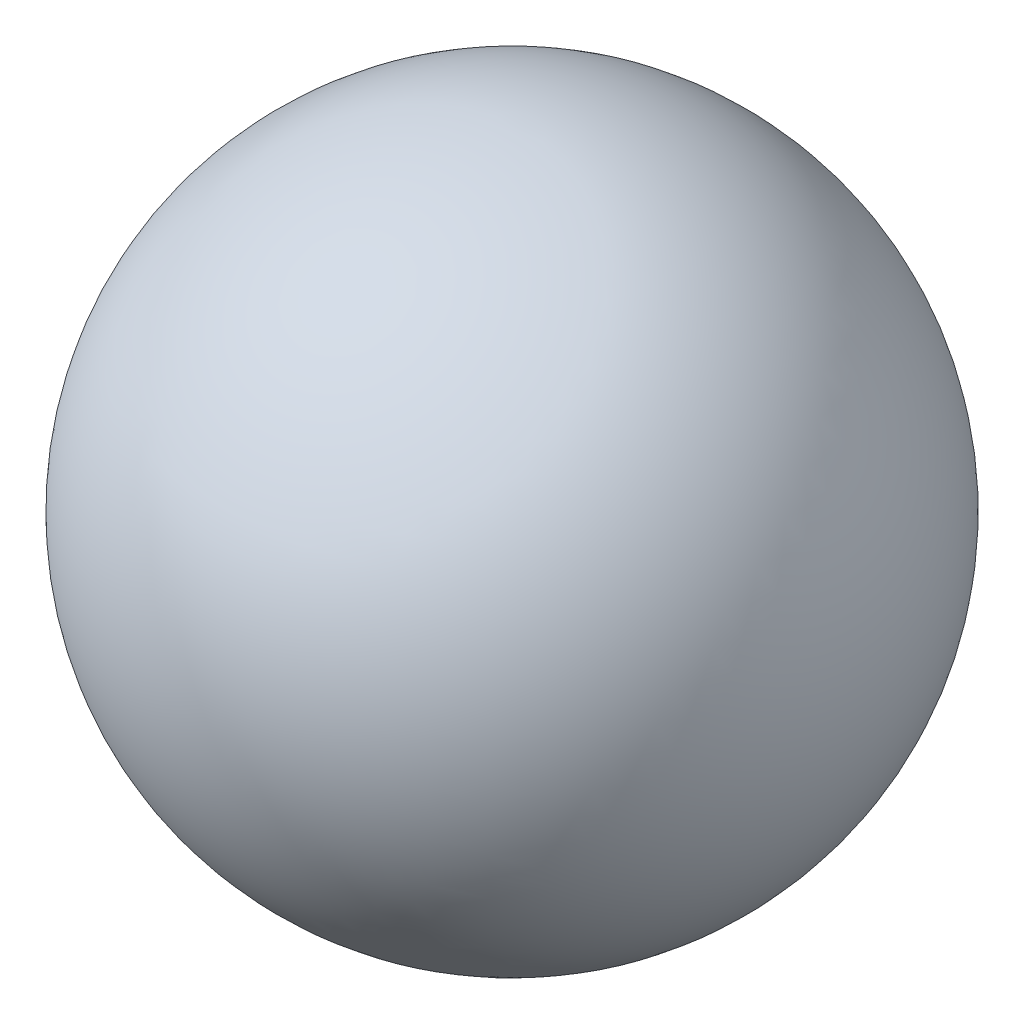
ISO-10303-21;
HEADER;
FILE_DESCRIPTION(('STEP AP214'),'2;1');
FILE_NAME('part.step','',(''),(''),'','','');
FILE_SCHEMA(('AUTOMOTIVE_DESIGN { 1 0 10303 214 1 1 1 1 }'));
ENDSEC;
DATA;
#1=APPLICATION_CONTEXT('core data for automotive mechanical design processes');
#2=APPLICATION_PROTOCOL_DEFINITION('international standard','automotive_design',2000,#1);
#3=PRODUCT_CONTEXT('',#1,'mechanical');
#4=PRODUCT('Part','Part','',(#3));
#5=PRODUCT_RELATED_PRODUCT_CATEGORY('part','',(#4));
#6=PRODUCT_DEFINITION_FORMATION('','',#4);
#7=PRODUCT_DEFINITION_CONTEXT('part definition',#1,'design');
#8=PRODUCT_DEFINITION('design','',#6,#7);
#9=PRODUCT_DEFINITION_SHAPE('','',#8);
#10=(LENGTH_UNIT() NAMED_UNIT(*) SI_UNIT(.MILLI.,.METRE.));
#11=(NAMED_UNIT(*) PLANE_ANGLE_UNIT() SI_UNIT($,.RADIAN.));
#12=(NAMED_UNIT(*) SI_UNIT($,.STERADIAN.) SOLID_ANGLE_UNIT());
#13=UNCERTAINTY_MEASURE_WITH_UNIT(LENGTH_MEASURE(1.E-05),#10,'distance_accuracy_value','');
#14=(GEOMETRIC_REPRESENTATION_CONTEXT(3) GLOBAL_UNCERTAINTY_ASSIGNED_CONTEXT((#13)) GLOBAL_UNIT_ASSIGNED_CONTEXT((#10,
#11,#12)) REPRESENTATION_CONTEXT('',''));
#15=CARTESIAN_POINT('',(0.,0.,0.));
#16=DIRECTION('',(0.,0.,1.));
#17=DIRECTION('',(1.,0.,0.));
#18=AXIS2_PLACEMENT_3D('',#15,#16,#17);
#19=CARTESIAN_POINT('',(0.,30.,0.));
#20=DIRECTION('',(0.,-1.,0.));
#21=DIRECTION('',(1.,0.,0.));
#22=AXIS2_PLACEMENT_3D('',#19,#20,#21);
#23=SPHERICAL_SURFACE('',#22,28.);
#24=CARTESIAN_POINT('',(-1.69343771057122,16.8390950446225,-24.6560911057137));
#25=CARTESIAN_POINT('',(-1.80721544557106,16.7343212200804,-24.5923494827678));
#26=CARTESIAN_POINT('',(-1.90955386479451,16.6205339274216,-24.5228758961835));
#27=CARTESIAN_POINT('',(-2.0900146818158,16.3800412842508,-24.3753297234898));
#28=CARTESIAN_POINT('',(-2.16810496618143,16.2533190956402,-24.2972459180732));
#29=CARTESIAN_POINT('',(-2.29934120839413,15.992104114174,-24.1354433820733));
#30=CARTESIAN_POINT('',(-2.35262130899541,15.8576576310213,-24.0517578199788));
#31=CARTESIAN_POINT('',(-2.43501793158054,15.5840463948556,-23.8805094076227));
#32=CARTESIAN_POINT('',(-2.46413866941952,15.444882469459,-23.7929472366472));
#33=CARTESIAN_POINT('',(-2.50060558721634,15.1480764095243,-23.6051291175781));
#34=CARTESIAN_POINT('',(-2.50491637262718,14.9902224646509,-23.5046117118278));
#35=CARTESIAN_POINT('',(-2.48395669965006,14.6763926172871,-23.3034741809311));
#36=CARTESIAN_POINT('',(-2.45865986440596,14.5204185146571,-23.2028540441034));
#37=CARTESIAN_POINT('',(-2.37632360178159,14.2056041334994,-22.9984596836698));
#38=CARTESIAN_POINT('',(-2.31754167946597,14.0471152273647,-22.8948370480418));
#39=CARTESIAN_POINT('',(-2.16711778754105,13.7420411405466,-22.6940802689311));
#40=CARTESIAN_POINT('',(-2.07550831407856,13.5954443631663,-22.596939821106));
#41=CARTESIAN_POINT('',(-1.88462855289481,13.3518671108071,-22.434594780959));
#42=CARTESIAN_POINT('',(-1.79191522547097,13.2512116691154,-22.3671706509649));
#43=CARTESIAN_POINT('',(-1.58789766349314,13.0641085666648,-22.2413399067739));
#44=CARTESIAN_POINT('',(-1.47661714601608,12.9776430561743,-22.1829219692449));
#45=CARTESIAN_POINT('',(-1.25493690770267,12.83439063017,-22.0858263464559));
#46=CARTESIAN_POINT('',(-1.14687938689784,12.7751008741841,-22.0455040913048));
#47=CARTESIAN_POINT('',(-0.920302512604455,12.6722340805023,-21.9754011388751));
#48=CARTESIAN_POINT('',(-0.801787308814908,12.6286508449164,-21.9456162835585));
#49=CARTESIAN_POINT('',(-0.55655986563234,12.5593959881228,-21.8982294658502));
#50=CARTESIAN_POINT('',(-0.429808537580653,12.5338178130532,-21.8806910662007));
#51=CARTESIAN_POINT('',(-0.172743442978666,12.5026218588909,-21.8592949912988));
#52=CARTESIAN_POINT('',(-0.0424312539702726,12.4969953807129,-21.8554313537518));
#53=CARTESIAN_POINT('',(0.205059737953623,12.505636101891,-21.8613605073564));
#54=CARTESIAN_POINT('',(0.32233704589999,12.5181089627676,-21.869921548045));
#55=CARTESIAN_POINT('',(0.55268397712324,12.5590526070629,-21.8979855786076));
#56=CARTESIAN_POINT('',(0.665753654147137,12.5875231860568,-21.917488428663));
#57=CARTESIAN_POINT('',(0.885613692983504,12.6592400147517,-21.9665153994858));
#58=CARTESIAN_POINT('',(0.992357638593603,12.7025826315287,-21.9961048706475));
#59=CARTESIAN_POINT('',(1.19671669609951,12.8020916220582,-22.0638594419222));
#60=CARTESIAN_POINT('',(1.29432885160541,12.8582621286881,-22.1020273057507));
#61=CARTESIAN_POINT('',(1.48948439810347,12.9883609888485,-22.1901549337846));
#62=CARTESIAN_POINT('',(1.58578517680883,13.0635760695449,-22.240958148));
#63=CARTESIAN_POINT('',(1.76442414619018,13.2248073669259,-22.349433263072));
#64=CARTESIAN_POINT('',(1.8467546684326,13.3108294709145,-22.4071089069087));
#65=CARTESIAN_POINT('',(2.00945278285601,13.5063977718894,-22.5376764503863));
#66=CARTESIAN_POINT('',(2.08722404439975,13.6174782362669,-22.6115046987858));
#67=CARTESIAN_POINT('',(2.22286097972882,13.8481249691288,-22.7639974179274));
#68=CARTESIAN_POINT('',(2.28071461944203,13.9676963153009,-22.8426647787136));
#69=CARTESIAN_POINT('',(2.38414232318549,14.2324275298433,-23.0158959407271));
#70=CARTESIAN_POINT('',(2.42624371232076,14.3786093947427,-23.1109811402494));
#71=CARTESIAN_POINT('',(2.48341552311309,14.6752160897262,-23.3026971140034));
#72=CARTESIAN_POINT('',(2.49847126444459,14.8256431791451,-23.3993286989188));
#73=CARTESIAN_POINT('',(2.50144040783855,15.1414585444242,-23.6009498329148));
#74=CARTESIAN_POINT('',(2.48667030403915,15.3069244007669,-23.7058714905356));
#75=CARTESIAN_POINT('',(2.42398647095646,15.6340591467102,-23.9119719396783));
#76=CARTESIAN_POINT('',(2.3760572376099,15.7957262235566,-24.0131489570128));
#77=CARTESIAN_POINT('',(2.24765238017885,16.107249414231,-24.20695619128));
#78=CARTESIAN_POINT('',(2.16770173631508,16.2572515428551,-24.299695998421));
#79=CARTESIAN_POINT('',(1.9754241817146,16.5417675759211,-24.4746942834401));
#80=CARTESIAN_POINT('',(1.86315870411258,16.676310197375,-24.5569722262374));
#81=CARTESIAN_POINT('',(1.64276022234429,16.888916297479,-24.6864434357093));
#82=CARTESIAN_POINT('',(1.54182764462273,16.9723826287008,-24.7370893142265));
#83=CARTESIAN_POINT('',(1.32515536462847,17.1240070582851,-24.8288605024288));
#84=CARTESIAN_POINT('',(1.20942442926551,17.1921741549376,-24.8699914088127));
#85=CARTESIAN_POINT('',(0.964918933499779,17.3102953309664,-24.941133546458));
#86=CARTESIAN_POINT('',(0.83607412881501,17.3601439388179,-24.9710803993912));
#87=CARTESIAN_POINT('',(0.569710350453295,17.4381651419889,-25.017903835515));
#88=CARTESIAN_POINT('',(0.432196008908252,17.4663492082301,-25.034787335509));
#89=CARTESIAN_POINT('',(0.167708560068092,17.4975520659172,-25.0534755433576));
#90=CARTESIAN_POINT('',(0.041096434177254,17.5028505555153,-25.0566462677171));
#91=CARTESIAN_POINT('',(-0.211217873573844,17.4942544767305,-25.0514997968747));
#92=CARTESIAN_POINT('',(-0.336920295665798,17.4803651762672,-25.0431857547628));
#93=CARTESIAN_POINT('',(-0.578437130778419,17.4351354840974,-25.0160795259398));
#94=CARTESIAN_POINT('',(-0.69444531856237,17.4045460880403,-24.9977382146975));
#95=CARTESIAN_POINT('',(-0.919226178488506,17.3279019359643,-24.9517050404129));
#96=CARTESIAN_POINT('',(-1.02799899135123,17.2818474808301,-24.9240133592892));
#97=CARTESIAN_POINT('',(-1.23604671614979,17.1761898713239,-24.860344034682));
#98=CARTESIAN_POINT('',(-1.33532332047684,17.1165891375527,-24.8243678715474));
#99=CARTESIAN_POINT('',(-1.52287765263926,16.9859329183521,-24.745293448164));
#100=CARTESIAN_POINT('',(-1.61114947106108,16.914871325178,-24.7021913900598));
#101=CARTESIAN_POINT('',(-1.69343771057122,16.8390950446225,-24.6560911057137));
#102=B_SPLINE_CURVE_WITH_KNOTS('',3,(#24,#25,#26,#27,#28,#29,#30,#31,#32,#33,#34,#35,#36,#37,
#38,#39,#40,#41,#42,#43,#44,#45,#46,#47,#48,#49,#50,#51,#52,#53,#54,#55,#56,#57,#58,#59,#60,#61,
#62,#63,#64,#65,#66,#67,#68,#69,#70,#71,#72,#73,#74,#75,#76,#77,#78,#79,#80,#81,#82,#83,#84,#85,
#86,#87,#88,#89,#90,#91,#92,#93,#94,#95,#96,#97,#98,#99,#100,#101),.UNSPECIFIED.,.T.,.F.,(4,2,2,
2,2,2,2,2,2,2,2,2,2,2,2,2,2,2,2,2,2,2,2,2,2,2,2,2,2,2,2,2,2,2,2,2,2,2,4),(0.,0.501370739223639,
1.00340267292509,1.50268778714811,2.00188575682414,2.56104143398055,3.12069563151671,
3.71254806600966,4.30381623416395,4.7597013736296,5.2150085781138,5.60243411902613,
5.98970661159021,6.37897451483074,6.76807267354658,7.12113147493536,7.4741857649079,
7.82957236657315,8.18507362829031,8.58056026824904,8.97626329798258,9.43767712767019,
9.89936925275219,10.4353346289203,10.971590838258,11.5582389113865,12.145161466427,
12.7228316308344,13.2994107693926,13.7189720557121,14.1382859253503,14.5599775745039,
14.9814457926612,15.3597924897254,15.7380353340821,16.1005230708412,16.4630037555268,
16.8254197189524,17.1880294639317),.UNSPECIFIED.);
#103=CARTESIAN_POINT('',(-1.69343771057122,16.8390950446225,-24.6560911057137));
#104=VERTEX_POINT('',#103);
#105=EDGE_CURVE('E10',#104,#104,#102,.T.);
#106=ORIENTED_EDGE('',*,*,#105,.F.);
#107=EDGE_LOOP('',(#106));
#108=FACE_BOUND('',#107,.T.);
#109=ADVANCED_FACE('F41',(#108),#23,.F.);
#110=CARTESIAN_POINT('',(0.,15.,-30.001));
#111=DIRECTION('',(0.,0.,1.));
#112=DIRECTION('',(1.,0.,0.));
#113=AXIS2_PLACEMENT_3D('',#110,#111,#112);
#114=CYLINDRICAL_SURFACE('',#113,2.5);
#115=ORIENTED_EDGE('',*,*,#105,.T.);
#116=EDGE_LOOP('',(#115));
#117=FACE_BOUND('',#116,.T.);
#118=CARTESIAN_POINT('',(-1.69244308339619,16.84001044717,-26.9063242927033));
#119=CARTESIAN_POINT('',(-1.80470110002598,16.7367455509334,-26.8487546093405));
#120=CARTESIAN_POINT('',(-1.9061580265769,16.6244003906173,-26.7859375477737));
#121=CARTESIAN_POINT('',(-2.08574747435769,16.3863621212176,-26.6523048523263));
#122=CARTESIAN_POINT('',(-2.16382067209951,16.2606361414582,-26.5814694926412));
#123=CARTESIAN_POINT('',(-2.29548018148668,16.0009201022737,-26.4345033349656));
#124=CARTESIAN_POINT('',(-2.34919418146151,15.8669774150478,-26.3584026183529));
#125=CARTESIAN_POINT('',(-2.43260469468968,15.5939810028407,-26.2025858155837));
#126=CARTESIAN_POINT('',(-2.46231071746393,15.4549293243624,-26.1228711741234));
#127=CARTESIAN_POINT('',(-2.49964531238921,15.1608546255147,-25.9534871806851));
#128=CARTESIAN_POINT('',(-2.50476962546438,15.0056247569919,-25.8636193873595));
#129=CARTESIAN_POINT('',(-2.48636658032132,14.6967859298406,-25.6838794970489));
#130=CARTESIAN_POINT('',(-2.46282251983601,14.5431779687498,-25.594007428088));
#131=CARTESIAN_POINT('',(-2.38545409089055,14.2344198216486,-25.4124224022299));
#132=CARTESIAN_POINT('',(-2.33024206407474,14.0795441063203,-25.320825366407));
#133=CARTESIAN_POINT('',(-2.18887457576023,13.7809267854306,-25.1433030182523));
#134=CARTESIAN_POINT('',(-2.10271359012714,13.6371871731437,-25.0573787217012));
#135=CARTESIAN_POINT('',(-1.90514664299241,13.3733084402181,-24.8988997039292));
#136=CARTESIAN_POINT('',(-1.79523453874315,13.252344266397,-24.8258890507411));
#137=CARTESIAN_POINT('',(-1.61139876145512,13.0868333309574,-24.7256169151847));
#138=CARTESIAN_POINT('',(-1.54698020467803,13.0343317502158,-24.6937413705277));
#139=CARTESIAN_POINT('',(-1.41215942740941,12.9353465949657,-24.6335401349075));
#140=CARTESIAN_POINT('',(-1.34175957825838,12.8888606537721,-24.605213048044));
#141=CARTESIAN_POINT('',(-1.16262761302417,12.7833827868206,-24.5408422049033));
#142=CARTESIAN_POINT('',(-1.05084606574836,12.7281108994569,-24.5070223797315));
#143=CARTESIAN_POINT('',(-0.818078722879118,12.6343121314047,-24.4495438994112));
#144=CARTESIAN_POINT('',(-0.697099291783994,12.5957737936068,-24.4258782920151));
#145=CARTESIAN_POINT('',(-0.448559121397535,12.5372490199952,-24.3899118671471));
#146=CARTESIAN_POINT('',(-0.320975268698819,12.5173331435409,-24.3776542747537));
#147=CARTESIAN_POINT('',(-0.063676239575446,12.4974844906564,-24.3654381389472));
#148=CARTESIAN_POINT('',(0.0660385726014728,12.4975483338835,-24.3654775150261));
#149=CARTESIAN_POINT('',(0.314786195245959,12.5169684781868,-24.3774297610518));
#150=CARTESIAN_POINT('',(0.433959603040743,12.5350530694516,-24.3885599600815));
#151=CARTESIAN_POINT('',(0.667152881153032,12.5876985979856,-24.4209176040736));
#152=CARTESIAN_POINT('',(0.781172651103403,12.6222598559869,-24.442145245591));
#153=CARTESIAN_POINT('',(1.00364025193365,12.7071460573558,-24.4941843558916));
#154=CARTESIAN_POINT('',(1.11192389476889,12.7577824895168,-24.5251851077869));
#155=CARTESIAN_POINT('',(1.31823150456421,12.8725098835174,-24.5952540432793));
#156=CARTESIAN_POINT('',(1.41625206622682,12.9366052899864,-24.6343248918379));
#157=CARTESIAN_POINT('',(1.61028542105624,13.0834177318932,-24.7235660648624));
#158=CARTESIAN_POINT('',(1.70501429697493,13.1673816460798,-24.774470101812));
#159=CARTESIAN_POINT('',(1.87912994829467,13.346372514889,-24.8826064297575));
#160=CARTESIAN_POINT('',(1.95850891842727,13.4414050586492,-24.9398419170991));
#161=CARTESIAN_POINT('',(2.11154709760494,13.6542967046142,-25.0675792877079));
#162=CARTESIAN_POINT('',(2.18276345319712,13.7734764224607,-25.138807670571));
#163=CARTESIAN_POINT('',(2.30394053307259,14.0198320803409,-25.2853780955886));
#164=CARTESIAN_POINT('',(2.35388970585198,14.1470123230155,-25.3607223483202));
#165=CARTESIAN_POINT('',(2.43738043340425,14.4232903302409,-25.5236392314501));
#166=CARTESIAN_POINT('',(2.46796733466895,14.5730964889612,-25.6115338252768));
#167=CARTESIAN_POINT('',(2.50152685704154,14.8754259548056,-25.7879928908241));
#168=CARTESIAN_POINT('',(2.50448662688553,15.027950493386,-25.8765576551181));
#169=CARTESIAN_POINT('',(2.48184113889202,15.3416835710105,-26.0578054792022));
#170=CARTESIAN_POINT('',(2.45439345169345,15.5028223417011,-26.150388813386));
#171=CARTESIAN_POINT('',(2.36771379239663,15.8190255034803,-26.3311400392932));
#172=CARTESIAN_POINT('',(2.30847901418956,15.9740893569889,-26.4193075404431));
#173=CARTESIAN_POINT('',(2.16071725111191,16.2678548277644,-26.5855663671278));
#174=CARTESIAN_POINT('',(2.07318171009687,16.4069199674208,-26.6638889634512));
#175=CARTESIAN_POINT('',(1.86931193764549,16.6682619598492,-26.8105059900955));
#176=CARTESIAN_POINT('',(1.75300116062771,16.7905523599808,-26.8788085158077));
#177=CARTESIAN_POINT('',(1.50873440158437,16.9991017787476,-26.9949262193183));
#178=CARTESIAN_POINT('',(1.383657925155,17.0878875469779,-27.0441944019101));
#179=CARTESIAN_POINT('',(1.18312577236907,17.2036776250905,-27.1083158299641));
#180=CARTESIAN_POINT('',(1.11412334734829,17.2393781786678,-27.1280605745225));
#181=CARTESIAN_POINT('',(0.972343126142675,17.3044811561932,-27.1640342468641));
#182=CARTESIAN_POINT('',(0.899565951381754,17.3338846127482,-27.1802637510862));
#183=CARTESIAN_POINT('',(0.69721394519105,17.404625393785,-27.2192832743737));
#184=CARTESIAN_POINT('',(0.564490280854794,17.439301082716,-27.2383772595281));
#185=CARTESIAN_POINT('',(0.294100465681308,17.4864295158054,-27.2643184160452));
#186=CARTESIAN_POINT('',(0.156437868636638,17.4988979244836,-27.2711742199555));
#187=CARTESIAN_POINT('',(-0.106590046180209,17.5008689195947,-27.2722581216505));
#188=CARTESIAN_POINT('',(-0.231940049227651,17.4923489864621,-27.2675735320073));
#189=CARTESIAN_POINT('',(-0.479182440479041,17.4568231467435,-27.2480235758659));
#190=CARTESIAN_POINT('',(-0.601074465139475,17.4298153039356,-27.2331571430326));
#191=CARTESIAN_POINT('',(-0.837239112637147,17.3588436494857,-27.1940376889017));
#192=CARTESIAN_POINT('',(-0.951558281671077,17.3149974654902,-27.1698497806428));
#193=CARTESIAN_POINT('',(-1.1708063715927,17.2122056775578,-27.1130406057359));
#194=CARTESIAN_POINT('',(-1.27574289381853,17.1532724486949,-27.0804262506377));
#195=CARTESIAN_POINT('',(-1.43176263899506,17.050533433946,-27.0234423017165));
#196=CARTESIAN_POINT('',(-1.48667042811056,17.0110506455001,-27.0015194466735));
#197=CARTESIAN_POINT('',(-1.59254979697507,16.9282897567918,-26.9555044163727));
#198=CARTESIAN_POINT('',(-1.64352207706111,16.885012334738,-26.9314126287442));
#199=CARTESIAN_POINT('',(-1.69244308339619,16.84001044717,-26.9063242927033));
#200=B_SPLINE_CURVE_WITH_KNOTS('',3,(#118,#119,#120,#121,#122,#123,#124,#125,#126,#127,#128,
#129,#130,#131,#132,#133,#134,#135,#136,#137,#138,#139,#140,#141,#142,#143,#144,#145,#146,#147,
#148,#149,#150,#151,#152,#153,#154,#155,#156,#157,#158,#159,#160,#161,#162,#163,#164,#165,#166,
#167,#168,#169,#170,#171,#172,#173,#174,#175,#176,#177,#178,#179,#180,#181,#182,#183,#184,#185,
#186,#187,#188,#189,#190,#191,#192,#193,#194,#195,#196,#197,#198,#199),.UNSPECIFIED.,.T.,.F.,(4,
2,2,2,2,2,2,2,2,2,2,2,2,2,2,2,2,2,2,2,2,2,2,2,2,2,2,2,2,2,2,2,2,2,2,2,2,2,2,2,4),(0.,
0.488814759434073,0.978859316015089,1.46630454632851,1.95355660561641,2.48952437182268,
3.02580454366766,3.58760516577864,4.14950611454587,4.68304341538674,4.94965835896393,
5.21616808938142,5.60200836228936,5.98758404030682,6.37461479042511,6.76158005935239,
7.1230431225295,7.48451322217185,7.85346549209456,8.22253979526357,8.63024296893829,
9.03815291344485,9.50441847530923,9.97093697235091,10.4977456632875,11.0247993966863,
11.5856236166858,12.1464973534135,12.6895344382644,13.2321303487255,13.7122981010833,
13.9524167757777,14.1924960452686,14.6055213279827,15.0182551563236,15.3936127976133,
15.7690097557787,16.1418306518572,16.5143467178169,16.7274056754846,16.940426630788),.UNSPECIFIED.);
#201=CARTESIAN_POINT('',(-1.69244308339619,16.84001044717,-26.9063242927033));
#202=VERTEX_POINT('',#201);
#203=EDGE_CURVE('E53',#202,#202,#200,.T.);
#204=ORIENTED_EDGE('',*,*,#203,.F.);
#205=EDGE_LOOP('',(#204));
#206=FACE_BOUND('',#205,.T.);
#207=ADVANCED_FACE('F64',(#117,#206),#114,.F.);
#208=CARTESIAN_POINT('',(0.,30.,0.));
#209=DIRECTION('',(0.,-1.,0.));
#210=DIRECTION('',(-1.,0.,0.));
#211=AXIS2_PLACEMENT_3D('',#208,#209,#210);
#212=SPHERICAL_SURFACE('',#211,30.);
#213=ORIENTED_EDGE('',*,*,#203,.T.);
#214=EDGE_LOOP('',(#213));
#215=FACE_BOUND('',#214,.T.);
#216=ADVANCED_FACE('F43',(#215),#212,.T.);
#217=CLOSED_SHELL('',(#109,#207,#216));
#218=MANIFOLD_SOLID_BREP('B2',#217);
#219=ADVANCED_BREP_SHAPE_REPRESENTATION('',(#18,#218),#14);
#220=SHAPE_DEFINITION_REPRESENTATION(#9,#219);
ENDSEC;
END-ISO-10303-21;
